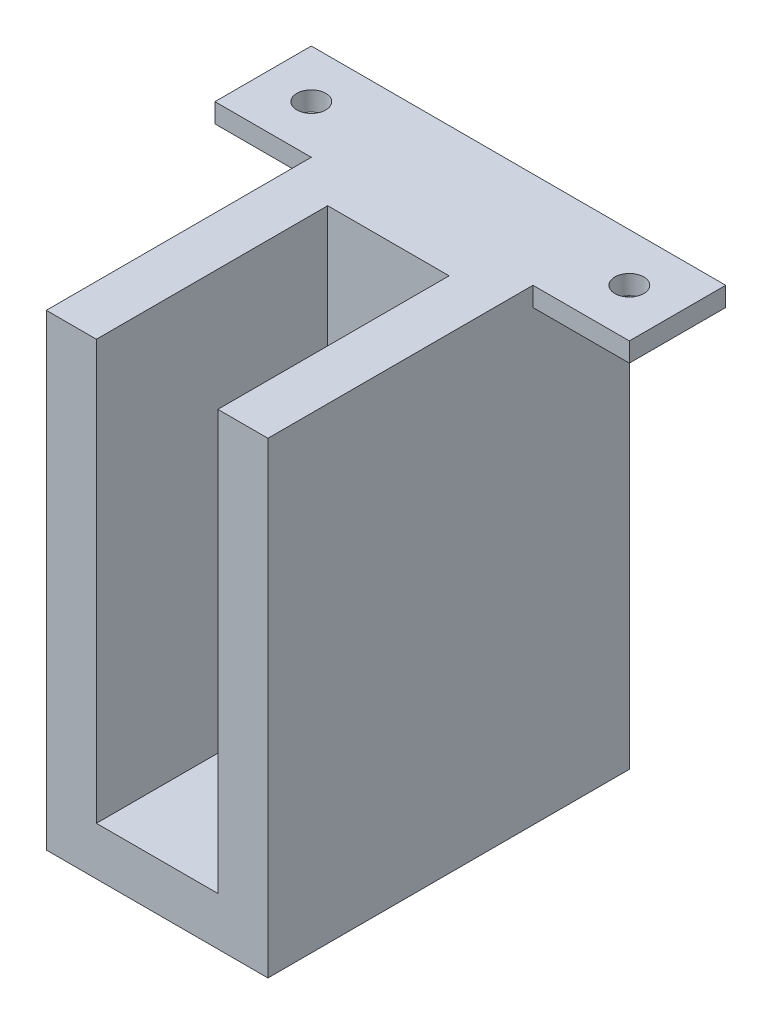
ISO-10303-21;
HEADER;
FILE_DESCRIPTION(('STEP AP214'),'2;1');
FILE_NAME('part.step','',(''),(''),'','','');
FILE_SCHEMA(('AUTOMOTIVE_DESIGN { 1 0 10303 214 1 1 1 1 }'));
ENDSEC;
DATA;
#1=APPLICATION_CONTEXT('core data for automotive mechanical design processes');
#2=APPLICATION_PROTOCOL_DEFINITION('international standard','automotive_design',2000,#1);
#3=PRODUCT_CONTEXT('',#1,'mechanical');
#4=PRODUCT('Part','Part','',(#3));
#5=PRODUCT_RELATED_PRODUCT_CATEGORY('part','',(#4));
#6=PRODUCT_DEFINITION_FORMATION('','',#4);
#7=PRODUCT_DEFINITION_CONTEXT('part definition',#1,'design');
#8=PRODUCT_DEFINITION('design','',#6,#7);
#9=PRODUCT_DEFINITION_SHAPE('','',#8);
#10=(LENGTH_UNIT() NAMED_UNIT(*) SI_UNIT(.MILLI.,.METRE.));
#11=(NAMED_UNIT(*) PLANE_ANGLE_UNIT() SI_UNIT($,.RADIAN.));
#12=(NAMED_UNIT(*) SI_UNIT($,.STERADIAN.) SOLID_ANGLE_UNIT());
#13=UNCERTAINTY_MEASURE_WITH_UNIT(LENGTH_MEASURE(1.E-05),#10,'distance_accuracy_value','');
#14=(GEOMETRIC_REPRESENTATION_CONTEXT(3) GLOBAL_UNCERTAINTY_ASSIGNED_CONTEXT((#13)) GLOBAL_UNIT_ASSIGNED_CONTEXT((#10,
#11,#12)) REPRESENTATION_CONTEXT('',''));
#15=CARTESIAN_POINT('',(0.,0.,0.));
#16=DIRECTION('',(0.,0.,1.));
#17=DIRECTION('',(1.,0.,0.));
#18=AXIS2_PLACEMENT_3D('',#15,#16,#17);
#19=CARTESIAN_POINT('',(11.5,48.5,18.75));
#20=DIRECTION('',(-1.,0.,0.));
#21=DIRECTION('',(0.,0.,1.));
#22=AXIS2_PLACEMENT_3D('',#19,#20,#21);
#23=PLANE('',#22);
#24=DIRECTION('',(0.,0.,-1.));
#25=VECTOR('',#24,1.);
#26=CARTESIAN_POINT('',(11.5,46.5,-18.75));
#27=LINE('',#26,#25);
#28=CARTESIAN_POINT('',(11.5,46.5,-8.75));
#29=VERTEX_POINT('',#28);
#30=CARTESIAN_POINT('',(11.5,46.5,-18.75));
#31=VERTEX_POINT('',#30);
#32=EDGE_CURVE('E191',#29,#31,#27,.T.);
#33=ORIENTED_EDGE('',*,*,#32,.F.);
#34=DIRECTION('',(0.,-1.,0.));
#35=VECTOR('',#34,1.);
#36=CARTESIAN_POINT('',(11.5,48.5,-8.75));
#37=LINE('',#36,#35);
#38=CARTESIAN_POINT('',(11.5,48.5,-8.74999999999999));
#39=VERTEX_POINT('',#38);
#40=EDGE_CURVE('E53',#39,#29,#37,.T.);
#41=ORIENTED_EDGE('',*,*,#40,.F.);
#42=DIRECTION('',(0.,0.,-1.));
#43=VECTOR('',#42,1.);
#44=CARTESIAN_POINT('',(11.5,48.5,18.75));
#45=LINE('',#44,#43);
#46=CARTESIAN_POINT('',(11.5,48.5,18.75));
#47=VERTEX_POINT('',#46);
#48=EDGE_CURVE('E175',#47,#39,#45,.T.);
#49=ORIENTED_EDGE('',*,*,#48,.F.);
#50=DIRECTION('',(0.,-1.,0.));
#51=VECTOR('',#50,1.);
#52=CARTESIAN_POINT('',(11.5,48.5,18.75));
#53=LINE('',#52,#51);
#54=CARTESIAN_POINT('',(11.5,0.,18.75));
#55=VERTEX_POINT('',#54);
#56=EDGE_CURVE('E295',#47,#55,#53,.T.);
#57=ORIENTED_EDGE('',*,*,#56,.T.);
#58=DIRECTION('',(0.,0.,-1.));
#59=VECTOR('',#58,1.);
#60=CARTESIAN_POINT('',(11.5,0.,18.75));
#61=LINE('',#60,#59);
#62=CARTESIAN_POINT('',(11.5,0.,-18.75));
#63=VERTEX_POINT('',#62);
#64=EDGE_CURVE('E279',#55,#63,#61,.T.);
#65=ORIENTED_EDGE('',*,*,#64,.T.);
#66=DIRECTION('',(0.,-1.,0.));
#67=VECTOR('',#66,1.);
#68=CARTESIAN_POINT('',(11.5,48.5,-18.75));
#69=LINE('',#68,#67);
#70=EDGE_CURVE('E11',#31,#63,#69,.T.);
#71=ORIENTED_EDGE('',*,*,#70,.F.);
#72=EDGE_LOOP('',(#33,#41,#49,#57,#65,#71));
#73=FACE_BOUND('',#72,.T.);
#74=ADVANCED_FACE('F37',(#73),#23,.F.);
#75=CARTESIAN_POINT('',(-11.5,48.5,18.75));
#76=DIRECTION('',(1.,0.,0.));
#77=DIRECTION('',(0.,0.,-1.));
#78=AXIS2_PLACEMENT_3D('',#75,#76,#77);
#79=PLANE('',#78);
#80=DIRECTION('',(0.,1.,0.));
#81=VECTOR('',#80,1.);
#82=CARTESIAN_POINT('',(-11.5,48.5,-8.74999999999999));
#83=LINE('',#82,#81);
#84=CARTESIAN_POINT('',(-11.5,46.5,-8.75));
#85=VERTEX_POINT('',#84);
#86=CARTESIAN_POINT('',(-11.5,48.5,-8.74999999999999));
#87=VERTEX_POINT('',#86);
#88=EDGE_CURVE('E210',#85,#87,#83,.T.);
#89=ORIENTED_EDGE('',*,*,#88,.F.);
#90=DIRECTION('',(0.,0.,1.));
#91=VECTOR('',#90,1.);
#92=CARTESIAN_POINT('',(-11.5,46.5,-18.75));
#93=LINE('',#92,#91);
#94=CARTESIAN_POINT('',(-11.5,46.5,-18.75));
#95=VERTEX_POINT('',#94);
#96=EDGE_CURVE('E207',#95,#85,#93,.T.);
#97=ORIENTED_EDGE('',*,*,#96,.F.);
#98=DIRECTION('',(0.,-1.,0.));
#99=VECTOR('',#98,1.);
#100=CARTESIAN_POINT('',(-11.5,48.5,-18.75));
#101=LINE('',#100,#99);
#102=CARTESIAN_POINT('',(-11.5,0.,-18.75));
#103=VERTEX_POINT('',#102);
#104=EDGE_CURVE('E45',#95,#103,#101,.T.);
#105=ORIENTED_EDGE('',*,*,#104,.T.);
#106=DIRECTION('',(0.,0.,1.));
#107=VECTOR('',#106,1.);
#108=CARTESIAN_POINT('',(-11.5,0.,18.75));
#109=LINE('',#108,#107);
#110=CARTESIAN_POINT('',(-11.5,0.,18.75));
#111=VERTEX_POINT('',#110);
#112=EDGE_CURVE('E299',#103,#111,#109,.T.);
#113=ORIENTED_EDGE('',*,*,#112,.T.);
#114=DIRECTION('',(0.,-1.,0.));
#115=VECTOR('',#114,1.);
#116=CARTESIAN_POINT('',(-11.5,48.5,18.75));
#117=LINE('',#116,#115);
#118=CARTESIAN_POINT('',(-11.5,48.5,18.75));
#119=VERTEX_POINT('',#118);
#120=EDGE_CURVE('E304',#119,#111,#117,.T.);
#121=ORIENTED_EDGE('',*,*,#120,.F.);
#122=DIRECTION('',(0.,0.,1.));
#123=VECTOR('',#122,1.);
#124=CARTESIAN_POINT('',(-11.5,48.5,18.75));
#125=LINE('',#124,#123);
#126=EDGE_CURVE('E174',#87,#119,#125,.T.);
#127=ORIENTED_EDGE('',*,*,#126,.F.);
#128=EDGE_LOOP('',(#89,#97,#105,#113,#121,#127));
#129=FACE_BOUND('',#128,.T.);
#130=ADVANCED_FACE('F338',(#129),#79,.F.);
#131=CARTESIAN_POINT('',(-6.3,5.,-5.24999999999999));
#132=DIRECTION('',(0.,0.,-1.));
#133=DIRECTION('',(-1.,0.,0.));
#134=AXIS2_PLACEMENT_3D('',#131,#132,#133);
#135=PLANE('',#134);
#136=DIRECTION('',(0.,1.,0.));
#137=VECTOR('',#136,1.);
#138=CARTESIAN_POINT('',(6.3,5.,-5.24999999999999));
#139=LINE('',#138,#137);
#140=CARTESIAN_POINT('',(6.3,5.,-5.24999999999999));
#141=VERTEX_POINT('',#140);
#142=CARTESIAN_POINT('',(6.3,25.,-5.24999999999999));
#143=VERTEX_POINT('',#142);
#144=EDGE_CURVE('E281',#141,#143,#139,.T.);
#145=ORIENTED_EDGE('',*,*,#144,.T.);
#146=DIRECTION('',(1.,0.,0.));
#147=VECTOR('',#146,1.);
#148=CARTESIAN_POINT('',(6.3,25.,-5.24999999999999));
#149=LINE('',#148,#147);
#150=CARTESIAN_POINT('',(-6.3,25.,-5.24999999999999));
#151=VERTEX_POINT('',#150);
#152=EDGE_CURVE('E234',#151,#143,#149,.T.);
#153=ORIENTED_EDGE('',*,*,#152,.F.);
#154=DIRECTION('',(0.,1.,0.));
#155=VECTOR('',#154,1.);
#156=CARTESIAN_POINT('',(-6.3,5.,-5.24999999999999));
#157=LINE('',#156,#155);
#158=CARTESIAN_POINT('',(-6.3,5.,-5.24999999999999));
#159=VERTEX_POINT('',#158);
#160=EDGE_CURVE('E276',#159,#151,#157,.T.);
#161=ORIENTED_EDGE('',*,*,#160,.F.);
#162=DIRECTION('',(-1.,0.,0.));
#163=VECTOR('',#162,1.);
#164=CARTESIAN_POINT('',(-6.3,5.,-5.24999999999999));
#165=LINE('',#164,#163);
#166=EDGE_CURVE('E266',#141,#159,#165,.T.);
#167=ORIENTED_EDGE('',*,*,#166,.F.);
#168=EDGE_LOOP('',(#145,#153,#161,#167));
#169=FACE_BOUND('',#168,.T.);
#170=ADVANCED_FACE('F342',(#169),#135,.F.);
#171=CARTESIAN_POINT('',(-11.5,48.5,-18.75));
#172=DIRECTION('',(0.,0.,1.));
#173=DIRECTION('',(1.,0.,0.));
#174=AXIS2_PLACEMENT_3D('',#171,#172,#173);
#175=PLANE('',#174);
#176=DIRECTION('',(-1.,0.,0.));
#177=VECTOR('',#176,1.);
#178=CARTESIAN_POINT('',(-11.5,0.,-18.75));
#179=LINE('',#178,#177);
#180=EDGE_CURVE('E297',#63,#103,#179,.T.);
#181=ORIENTED_EDGE('',*,*,#180,.T.);
#182=ORIENTED_EDGE('',*,*,#104,.F.);
#183=DIRECTION('',(1.,0.,0.));
#184=VECTOR('',#183,1.);
#185=CARTESIAN_POINT('',(-21.5,46.5,-18.75));
#186=LINE('',#185,#184);
#187=CARTESIAN_POINT('',(-21.5,46.5,-18.75));
#188=VERTEX_POINT('',#187);
#189=EDGE_CURVE('E226',#188,#95,#186,.T.);
#190=ORIENTED_EDGE('',*,*,#189,.F.);
#191=DIRECTION('',(0.,-1.,0.));
#192=VECTOR('',#191,1.);
#193=CARTESIAN_POINT('',(-21.5,48.5,-18.75));
#194=LINE('',#193,#192);
#195=CARTESIAN_POINT('',(-21.5,48.5,-18.75));
#196=VERTEX_POINT('',#195);
#197=EDGE_CURVE('E170',#196,#188,#194,.T.);
#198=ORIENTED_EDGE('',*,*,#197,.F.);
#199=DIRECTION('',(-1.,0.,0.));
#200=VECTOR('',#199,1.);
#201=CARTESIAN_POINT('',(-11.5,48.5,-18.75));
#202=LINE('',#201,#200);
#203=CARTESIAN_POINT('',(21.5,48.5,-18.75));
#204=VERTEX_POINT('',#203);
#205=EDGE_CURVE('E161',#204,#196,#202,.T.);
#206=ORIENTED_EDGE('',*,*,#205,.F.);
#207=DIRECTION('',(0.,1.,0.));
#208=VECTOR('',#207,1.);
#209=CARTESIAN_POINT('',(21.5,48.5,-18.75));
#210=LINE('',#209,#208);
#211=CARTESIAN_POINT('',(21.5,46.5,-18.75));
#212=VERTEX_POINT('',#211);
#213=EDGE_CURVE('E167',#212,#204,#210,.T.);
#214=ORIENTED_EDGE('',*,*,#213,.F.);
#215=DIRECTION('',(-1.,0.,0.));
#216=VECTOR('',#215,1.);
#217=CARTESIAN_POINT('',(21.5,46.5,-18.75));
#218=LINE('',#217,#216);
#219=EDGE_CURVE('E200',#212,#31,#218,.T.);
#220=ORIENTED_EDGE('',*,*,#219,.T.);
#221=ORIENTED_EDGE('',*,*,#70,.T.);
#222=EDGE_LOOP('',(#181,#182,#190,#198,#206,#214,#220,#221));
#223=FACE_BOUND('',#222,.T.);
#224=ADVANCED_FACE('F164',(#223),#175,.F.);
#225=CARTESIAN_POINT('',(-11.5,48.5,18.75));
#226=DIRECTION('',(0.,0.,-1.));
#227=DIRECTION('',(-1.,0.,0.));
#228=AXIS2_PLACEMENT_3D('',#225,#226,#227);
#229=PLANE('',#228);
#230=DIRECTION('',(1.,0.,0.));
#231=VECTOR('',#230,1.);
#232=CARTESIAN_POINT('',(-6.3,5.,18.75));
#233=LINE('',#232,#231);
#234=CARTESIAN_POINT('',(-6.3,5.,18.75));
#235=VERTEX_POINT('',#234);
#236=CARTESIAN_POINT('',(6.3,5.,18.75));
#237=VERTEX_POINT('',#236);
#238=EDGE_CURVE('E259',#235,#237,#233,.T.);
#239=ORIENTED_EDGE('',*,*,#238,.F.);
#240=DIRECTION('',(0.,1.,0.));
#241=VECTOR('',#240,1.);
#242=CARTESIAN_POINT('',(-6.3,5.,18.75));
#243=LINE('',#242,#241);
#244=CARTESIAN_POINT('',(-6.3,48.5,18.75));
#245=VERTEX_POINT('',#244);
#246=EDGE_CURVE('E269',#235,#245,#243,.T.);
#247=ORIENTED_EDGE('',*,*,#246,.T.);
#248=DIRECTION('',(1.,0.,0.));
#249=VECTOR('',#248,1.);
#250=CARTESIAN_POINT('',(-11.5,48.5,18.75));
#251=LINE('',#250,#249);
#252=EDGE_CURVE('E293',#119,#245,#251,.T.);
#253=ORIENTED_EDGE('',*,*,#252,.F.);
#254=ORIENTED_EDGE('',*,*,#120,.T.);
#255=DIRECTION('',(1.,0.,0.));
#256=VECTOR('',#255,1.);
#257=CARTESIAN_POINT('',(-11.5,0.,18.75));
#258=LINE('',#257,#256);
#259=EDGE_CURVE('E289',#111,#55,#258,.T.);
#260=ORIENTED_EDGE('',*,*,#259,.T.);
#261=ORIENTED_EDGE('',*,*,#56,.F.);
#262=CARTESIAN_POINT('',(6.3,48.5,18.75));
#263=VERTEX_POINT('',#262);
#264=EDGE_CURVE('E292',#263,#47,#251,.T.);
#265=ORIENTED_EDGE('',*,*,#264,.F.);
#266=DIRECTION('',(0.,1.,0.));
#267=VECTOR('',#266,1.);
#268=CARTESIAN_POINT('',(6.3,5.,18.75));
#269=LINE('',#268,#267);
#270=EDGE_CURVE('E285',#237,#263,#269,.T.);
#271=ORIENTED_EDGE('',*,*,#270,.F.);
#272=EDGE_LOOP('',(#239,#247,#253,#254,#260,#261,#265,#271));
#273=FACE_BOUND('',#272,.T.);
#274=ADVANCED_FACE('F324',(#273),#229,.F.);
#275=CARTESIAN_POINT('',(0.,48.5,0.));
#276=DIRECTION('',(0.,-1.,0.));
#277=DIRECTION('',(0.,0.,-1.));
#278=AXIS2_PLACEMENT_3D('',#275,#276,#277);
#279=PLANE('',#278);
#280=CARTESIAN_POINT('',(16.5,48.5,-13.75));
#281=DIRECTION('',(0.,1.,0.));
#282=DIRECTION('',(0.,0.,1.));
#283=AXIS2_PLACEMENT_3D('',#280,#281,#282);
#284=CIRCLE('',#283,1.5);
#285=CARTESIAN_POINT('',(16.5,48.5,-12.25));
#286=VERTEX_POINT('',#285);
#287=EDGE_CURVE('E309',#286,#286,#284,.T.);
#288=ORIENTED_EDGE('',*,*,#287,.F.);
#289=EDGE_LOOP('',(#288));
#290=FACE_BOUND('',#289,.T.);
#291=CARTESIAN_POINT('',(-16.5,48.5,-13.75));
#292=DIRECTION('',(0.,1.,0.));
#293=DIRECTION('',(0.,0.,1.));
#294=AXIS2_PLACEMENT_3D('',#291,#292,#293);
#295=CIRCLE('',#294,1.5);
#296=CARTESIAN_POINT('',(-16.5,48.5,-12.25));
#297=VERTEX_POINT('',#296);
#298=EDGE_CURVE('E195',#297,#297,#295,.T.);
#299=ORIENTED_EDGE('',*,*,#298,.F.);
#300=EDGE_LOOP('',(#299));
#301=FACE_BOUND('',#300,.T.);
#302=ORIENTED_EDGE('',*,*,#252,.T.);
#303=DIRECTION('',(0.,0.,1.));
#304=VECTOR('',#303,1.);
#305=CARTESIAN_POINT('',(-6.3,48.5,18.75));
#306=LINE('',#305,#304);
#307=CARTESIAN_POINT('',(-6.3,48.5,-5.24999999999999));
#308=VERTEX_POINT('',#307);
#309=EDGE_CURVE('E250',#308,#245,#306,.T.);
#310=ORIENTED_EDGE('',*,*,#309,.F.);
#311=DIRECTION('',(-1.,0.,0.));
#312=VECTOR('',#311,1.);
#313=CARTESIAN_POINT('',(-6.3,48.5,-5.24999999999999));
#314=LINE('',#313,#312);
#315=CARTESIAN_POINT('',(6.3,48.5,-5.24999999999999));
#316=VERTEX_POINT('',#315);
#317=EDGE_CURVE('E260',#316,#308,#314,.T.);
#318=ORIENTED_EDGE('',*,*,#317,.F.);
#319=DIRECTION('',(0.,0.,-1.));
#320=VECTOR('',#319,1.);
#321=CARTESIAN_POINT('',(6.3,48.5,18.75));
#322=LINE('',#321,#320);
#323=EDGE_CURVE('E271',#263,#316,#322,.T.);
#324=ORIENTED_EDGE('',*,*,#323,.F.);
#325=ORIENTED_EDGE('',*,*,#264,.T.);
#326=ORIENTED_EDGE('',*,*,#48,.T.);
#327=DIRECTION('',(-1.,0.,0.));
#328=VECTOR('',#327,1.);
#329=CARTESIAN_POINT('',(21.5,48.5,-8.75));
#330=LINE('',#329,#328);
#331=CARTESIAN_POINT('',(21.5,48.5,-8.75));
#332=VERTEX_POINT('',#331);
#333=EDGE_CURVE('E182',#332,#39,#330,.T.);
#334=ORIENTED_EDGE('',*,*,#333,.F.);
#335=DIRECTION('',(0.,0.,1.));
#336=VECTOR('',#335,1.);
#337=CARTESIAN_POINT('',(21.5,48.5,-18.75));
#338=LINE('',#337,#336);
#339=EDGE_CURVE('E178',#204,#332,#338,.T.);
#340=ORIENTED_EDGE('',*,*,#339,.F.);
#341=ORIENTED_EDGE('',*,*,#205,.T.);
#342=DIRECTION('',(0.,0.,-1.));
#343=VECTOR('',#342,1.);
#344=CARTESIAN_POINT('',(-21.5,48.5,-18.75));
#345=LINE('',#344,#343);
#346=CARTESIAN_POINT('',(-21.5,48.5,-8.74999999999999));
#347=VERTEX_POINT('',#346);
#348=EDGE_CURVE('E214',#347,#196,#345,.T.);
#349=ORIENTED_EDGE('',*,*,#348,.F.);
#350=DIRECTION('',(1.,0.,0.));
#351=VECTOR('',#350,1.);
#352=CARTESIAN_POINT('',(-21.5,48.5,-8.74999999999999));
#353=LINE('',#352,#351);
#354=EDGE_CURVE('E216',#347,#87,#353,.T.);
#355=ORIENTED_EDGE('',*,*,#354,.T.);
#356=ORIENTED_EDGE('',*,*,#126,.T.);
#357=EDGE_LOOP('',(#302,#310,#318,#324,#325,#326,#334,#340,#341,#349,#355,#356));
#358=FACE_BOUND('',#357,.T.);
#359=ADVANCED_FACE('F180',(#290,#301,#358),#279,.F.);
#360=CARTESIAN_POINT('',(0.,0.,0.));
#361=DIRECTION('',(0.,-1.,0.));
#362=DIRECTION('',(0.,0.,-1.));
#363=AXIS2_PLACEMENT_3D('',#360,#361,#362);
#364=PLANE('',#363);
#365=ORIENTED_EDGE('',*,*,#64,.F.);
#366=ORIENTED_EDGE('',*,*,#259,.F.);
#367=ORIENTED_EDGE('',*,*,#112,.F.);
#368=ORIENTED_EDGE('',*,*,#180,.F.);
#369=EDGE_LOOP('',(#365,#366,#367,#368));
#370=FACE_BOUND('',#369,.T.);
#371=ADVANCED_FACE('F323',(#370),#364,.T.);
#372=CARTESIAN_POINT('',(-6.3,5.,18.75));
#373=DIRECTION('',(-1.,0.,0.));
#374=DIRECTION('',(0.,0.,1.));
#375=AXIS2_PLACEMENT_3D('',#372,#373,#374);
#376=PLANE('',#375);
#377=ORIENTED_EDGE('',*,*,#309,.T.);
#378=ORIENTED_EDGE('',*,*,#246,.F.);
#379=DIRECTION('',(0.,0.,1.));
#380=VECTOR('',#379,1.);
#381=CARTESIAN_POINT('',(-6.3,5.,18.75));
#382=LINE('',#381,#380);
#383=EDGE_CURVE('E256',#159,#235,#382,.T.);
#384=ORIENTED_EDGE('',*,*,#383,.F.);
#385=ORIENTED_EDGE('',*,*,#160,.T.);
#386=DIRECTION('',(0.,0.,1.));
#387=VECTOR('',#386,1.);
#388=CARTESIAN_POINT('',(-6.3,25.,-10.25));
#389=LINE('',#388,#387);
#390=CARTESIAN_POINT('',(-6.3,25.,-10.25));
#391=VERTEX_POINT('',#390);
#392=EDGE_CURVE('E251',#391,#151,#389,.T.);
#393=ORIENTED_EDGE('',*,*,#392,.F.);
#394=DIRECTION('',(0.,-1.,0.));
#395=VECTOR('',#394,1.);
#396=CARTESIAN_POINT('',(-6.3,25.,-10.25));
#397=LINE('',#396,#395);
#398=CARTESIAN_POINT('',(-6.3,28.,-10.25));
#399=VERTEX_POINT('',#398);
#400=EDGE_CURVE('E237',#399,#391,#397,.T.);
#401=ORIENTED_EDGE('',*,*,#400,.F.);
#402=DIRECTION('',(0.,0.,1.));
#403=VECTOR('',#402,1.);
#404=CARTESIAN_POINT('',(-6.3,28.,-10.25));
#405=LINE('',#404,#403);
#406=CARTESIAN_POINT('',(-6.3,28.,-5.24999999999999));
#407=VERTEX_POINT('',#406);
#408=EDGE_CURVE('E253',#399,#407,#405,.T.);
#409=ORIENTED_EDGE('',*,*,#408,.T.);
#410=EDGE_CURVE('E280',#407,#308,#157,.T.);
#411=ORIENTED_EDGE('',*,*,#410,.T.);
#412=EDGE_LOOP('',(#377,#378,#384,#385,#393,#401,#409,#411));
#413=FACE_BOUND('',#412,.T.);
#414=ADVANCED_FACE('F331',(#413),#376,.F.);
#415=ORIENTED_EDGE('',*,*,#410,.F.);
#416=DIRECTION('',(-1.,0.,0.));
#417=VECTOR('',#416,1.);
#418=CARTESIAN_POINT('',(6.3,28.,-5.24999999999999));
#419=LINE('',#418,#417);
#420=CARTESIAN_POINT('',(6.3,28.,-5.24999999999999));
#421=VERTEX_POINT('',#420);
#422=EDGE_CURVE('E229',#421,#407,#419,.T.);
#423=ORIENTED_EDGE('',*,*,#422,.F.);
#424=EDGE_CURVE('E284',#421,#316,#139,.T.);
#425=ORIENTED_EDGE('',*,*,#424,.T.);
#426=ORIENTED_EDGE('',*,*,#317,.T.);
#427=EDGE_LOOP('',(#415,#423,#425,#426));
#428=FACE_BOUND('',#427,.T.);
#429=ADVANCED_FACE('F398',(#428),#135,.F.);
#430=CARTESIAN_POINT('',(6.3,5.,18.75));
#431=DIRECTION('',(1.,0.,0.));
#432=DIRECTION('',(0.,0.,-1.));
#433=AXIS2_PLACEMENT_3D('',#430,#431,#432);
#434=PLANE('',#433);
#435=ORIENTED_EDGE('',*,*,#323,.T.);
#436=ORIENTED_EDGE('',*,*,#424,.F.);
#437=DIRECTION('',(0.,0.,1.));
#438=VECTOR('',#437,1.);
#439=CARTESIAN_POINT('',(6.3,28.,-10.25));
#440=LINE('',#439,#438);
#441=CARTESIAN_POINT('',(6.3,28.,-10.25));
#442=VERTEX_POINT('',#441);
#443=EDGE_CURVE('E243',#442,#421,#440,.T.);
#444=ORIENTED_EDGE('',*,*,#443,.F.);
#445=DIRECTION('',(0.,1.,0.));
#446=VECTOR('',#445,1.);
#447=CARTESIAN_POINT('',(6.3,25.,-10.25));
#448=LINE('',#447,#446);
#449=CARTESIAN_POINT('',(6.3,25.,-10.25));
#450=VERTEX_POINT('',#449);
#451=EDGE_CURVE('E230',#450,#442,#448,.T.);
#452=ORIENTED_EDGE('',*,*,#451,.F.);
#453=DIRECTION('',(0.,0.,1.));
#454=VECTOR('',#453,1.);
#455=CARTESIAN_POINT('',(6.3,25.,-10.25));
#456=LINE('',#455,#454);
#457=EDGE_CURVE('E247',#450,#143,#456,.T.);
#458=ORIENTED_EDGE('',*,*,#457,.T.);
#459=ORIENTED_EDGE('',*,*,#144,.F.);
#460=DIRECTION('',(0.,0.,-1.));
#461=VECTOR('',#460,1.);
#462=CARTESIAN_POINT('',(6.3,5.,18.75));
#463=LINE('',#462,#461);
#464=EDGE_CURVE('E263',#237,#141,#463,.T.);
#465=ORIENTED_EDGE('',*,*,#464,.F.);
#466=ORIENTED_EDGE('',*,*,#270,.T.);
#467=EDGE_LOOP('',(#435,#436,#444,#452,#458,#459,#465,#466));
#468=FACE_BOUND('',#467,.T.);
#469=ADVANCED_FACE('F396',(#468),#434,.F.);
#470=CARTESIAN_POINT('',(0.,5.,0.));
#471=DIRECTION('',(0.,-1.,0.));
#472=DIRECTION('',(0.,0.,-1.));
#473=AXIS2_PLACEMENT_3D('',#470,#471,#472);
#474=PLANE('',#473);
#475=ORIENTED_EDGE('',*,*,#383,.T.);
#476=ORIENTED_EDGE('',*,*,#238,.T.);
#477=ORIENTED_EDGE('',*,*,#464,.T.);
#478=ORIENTED_EDGE('',*,*,#166,.T.);
#479=EDGE_LOOP('',(#475,#476,#477,#478));
#480=FACE_BOUND('',#479,.T.);
#481=ADVANCED_FACE('F389',(#480),#474,.F.);
#482=CARTESIAN_POINT('',(6.3,25.,-10.25));
#483=DIRECTION('',(0.,-1.,0.));
#484=DIRECTION('',(0.,0.,-1.));
#485=AXIS2_PLACEMENT_3D('',#482,#483,#484);
#486=PLANE('',#485);
#487=ORIENTED_EDGE('',*,*,#152,.T.);
#488=ORIENTED_EDGE('',*,*,#457,.F.);
#489=DIRECTION('',(1.,0.,0.));
#490=VECTOR('',#489,1.);
#491=CARTESIAN_POINT('',(6.3,25.,-10.25));
#492=LINE('',#491,#490);
#493=EDGE_CURVE('E240',#391,#450,#492,.T.);
#494=ORIENTED_EDGE('',*,*,#493,.F.);
#495=ORIENTED_EDGE('',*,*,#392,.T.);
#496=EDGE_LOOP('',(#487,#488,#494,#495));
#497=FACE_BOUND('',#496,.T.);
#498=ADVANCED_FACE('F386',(#497),#486,.F.);
#499=CARTESIAN_POINT('',(6.3,28.,-10.25));
#500=DIRECTION('',(0.,1.,0.));
#501=DIRECTION('',(0.,0.,1.));
#502=AXIS2_PLACEMENT_3D('',#499,#500,#501);
#503=PLANE('',#502);
#504=ORIENTED_EDGE('',*,*,#422,.T.);
#505=ORIENTED_EDGE('',*,*,#408,.F.);
#506=DIRECTION('',(-1.,0.,0.));
#507=VECTOR('',#506,1.);
#508=CARTESIAN_POINT('',(6.3,28.,-10.25));
#509=LINE('',#508,#507);
#510=EDGE_CURVE('E233',#442,#399,#509,.T.);
#511=ORIENTED_EDGE('',*,*,#510,.F.);
#512=ORIENTED_EDGE('',*,*,#443,.T.);
#513=EDGE_LOOP('',(#504,#505,#511,#512));
#514=FACE_BOUND('',#513,.T.);
#515=ADVANCED_FACE('F384',(#514),#503,.F.);
#516=CARTESIAN_POINT('',(0.,0.,-10.25));
#517=DIRECTION('',(0.,0.,1.));
#518=DIRECTION('',(1.,0.,0.));
#519=AXIS2_PLACEMENT_3D('',#516,#517,#518);
#520=PLANE('',#519);
#521=ORIENTED_EDGE('',*,*,#451,.T.);
#522=ORIENTED_EDGE('',*,*,#510,.T.);
#523=ORIENTED_EDGE('',*,*,#400,.T.);
#524=ORIENTED_EDGE('',*,*,#493,.T.);
#525=EDGE_LOOP('',(#521,#522,#523,#524));
#526=FACE_BOUND('',#525,.T.);
#527=ADVANCED_FACE('F377',(#526),#520,.T.);
#528=CARTESIAN_POINT('',(-21.5,46.5,-18.75));
#529=DIRECTION('',(0.,1.,0.));
#530=DIRECTION('',(0.,0.,1.));
#531=AXIS2_PLACEMENT_3D('',#528,#529,#530);
#532=PLANE('',#531);
#533=CARTESIAN_POINT('',(-16.5,46.5,-13.75));
#534=DIRECTION('',(0.,1.,0.));
#535=DIRECTION('',(0.,0.,1.));
#536=AXIS2_PLACEMENT_3D('',#533,#534,#535);
#537=CIRCLE('',#536,1.5);
#538=CARTESIAN_POINT('',(-16.5,46.5,-12.25));
#539=VERTEX_POINT('',#538);
#540=EDGE_CURVE('E40',#539,#539,#537,.T.);
#541=ORIENTED_EDGE('',*,*,#540,.T.);
#542=EDGE_LOOP('',(#541));
#543=FACE_BOUND('',#542,.T.);
#544=ORIENTED_EDGE('',*,*,#96,.T.);
#545=DIRECTION('',(1.,0.,0.));
#546=VECTOR('',#545,1.);
#547=CARTESIAN_POINT('',(-21.5,46.5,-8.75));
#548=LINE('',#547,#546);
#549=CARTESIAN_POINT('',(-21.5,46.5,-8.75));
#550=VERTEX_POINT('',#549);
#551=EDGE_CURVE('E223',#550,#85,#548,.T.);
#552=ORIENTED_EDGE('',*,*,#551,.F.);
#553=DIRECTION('',(0.,0.,1.));
#554=VECTOR('',#553,1.);
#555=CARTESIAN_POINT('',(-21.5,46.5,-18.75));
#556=LINE('',#555,#554);
#557=EDGE_CURVE('E209',#188,#550,#556,.T.);
#558=ORIENTED_EDGE('',*,*,#557,.F.);
#559=ORIENTED_EDGE('',*,*,#189,.T.);
#560=EDGE_LOOP('',(#544,#552,#558,#559));
#561=FACE_BOUND('',#560,.T.);
#562=ADVANCED_FACE('F362',(#543,#561),#532,.F.);
#563=CARTESIAN_POINT('',(-21.5,48.5,-8.74999999999999));
#564=DIRECTION('',(0.,0.,-1.));
#565=DIRECTION('',(0.,1.,0.));
#566=AXIS2_PLACEMENT_3D('',#563,#564,#565);
#567=PLANE('',#566);
#568=ORIENTED_EDGE('',*,*,#88,.T.);
#569=ORIENTED_EDGE('',*,*,#354,.F.);
#570=DIRECTION('',(0.,1.,0.));
#571=VECTOR('',#570,1.);
#572=CARTESIAN_POINT('',(-21.5,48.5,-8.74999999999999));
#573=LINE('',#572,#571);
#574=EDGE_CURVE('E212',#550,#347,#573,.T.);
#575=ORIENTED_EDGE('',*,*,#574,.F.);
#576=ORIENTED_EDGE('',*,*,#551,.T.);
#577=EDGE_LOOP('',(#568,#569,#575,#576));
#578=FACE_BOUND('',#577,.T.);
#579=ADVANCED_FACE('F369',(#578),#567,.F.);
#580=CARTESIAN_POINT('',(-21.5,0.,0.));
#581=DIRECTION('',(-1.,0.,0.));
#582=DIRECTION('',(0.,0.,1.));
#583=AXIS2_PLACEMENT_3D('',#580,#581,#582);
#584=PLANE('',#583);
#585=ORIENTED_EDGE('',*,*,#197,.T.);
#586=ORIENTED_EDGE('',*,*,#557,.T.);
#587=ORIENTED_EDGE('',*,*,#574,.T.);
#588=ORIENTED_EDGE('',*,*,#348,.T.);
#589=EDGE_LOOP('',(#585,#586,#587,#588));
#590=FACE_BOUND('',#589,.T.);
#591=ADVANCED_FACE('F366',(#590),#584,.T.);
#592=CARTESIAN_POINT('',(21.5,48.5,-8.75));
#593=DIRECTION('',(0.,0.,-1.));
#594=DIRECTION('',(-1.,0.,0.));
#595=AXIS2_PLACEMENT_3D('',#592,#593,#594);
#596=PLANE('',#595);
#597=ORIENTED_EDGE('',*,*,#40,.T.);
#598=DIRECTION('',(-1.,0.,0.));
#599=VECTOR('',#598,1.);
#600=CARTESIAN_POINT('',(21.5,46.5,-8.75));
#601=LINE('',#600,#599);
#602=CARTESIAN_POINT('',(21.5,46.5,-8.75));
#603=VERTEX_POINT('',#602);
#604=EDGE_CURVE('E203',#603,#29,#601,.T.);
#605=ORIENTED_EDGE('',*,*,#604,.F.);
#606=DIRECTION('',(0.,-1.,0.));
#607=VECTOR('',#606,1.);
#608=CARTESIAN_POINT('',(21.5,48.5,-8.75));
#609=LINE('',#608,#607);
#610=EDGE_CURVE('E185',#332,#603,#609,.T.);
#611=ORIENTED_EDGE('',*,*,#610,.F.);
#612=ORIENTED_EDGE('',*,*,#333,.T.);
#613=EDGE_LOOP('',(#597,#605,#611,#612));
#614=FACE_BOUND('',#613,.T.);
#615=ADVANCED_FACE('F348',(#614),#596,.F.);
#616=CARTESIAN_POINT('',(21.5,46.5,-18.75));
#617=DIRECTION('',(0.,1.,0.));
#618=DIRECTION('',(0.,0.,1.));
#619=AXIS2_PLACEMENT_3D('',#616,#617,#618);
#620=PLANE('',#619);
#621=CARTESIAN_POINT('',(16.5,46.5,-13.75));
#622=DIRECTION('',(0.,1.,0.));
#623=DIRECTION('',(0.,0.,1.));
#624=AXIS2_PLACEMENT_3D('',#621,#622,#623);
#625=CIRCLE('',#624,1.5);
#626=CARTESIAN_POINT('',(16.5,46.5,-12.25));
#627=VERTEX_POINT('',#626);
#628=EDGE_CURVE('E307',#627,#627,#625,.T.);
#629=ORIENTED_EDGE('',*,*,#628,.T.);
#630=EDGE_LOOP('',(#629));
#631=FACE_BOUND('',#630,.T.);
#632=ORIENTED_EDGE('',*,*,#32,.T.);
#633=ORIENTED_EDGE('',*,*,#219,.F.);
#634=DIRECTION('',(0.,0.,-1.));
#635=VECTOR('',#634,1.);
#636=CARTESIAN_POINT('',(21.5,46.5,-18.75));
#637=LINE('',#636,#635);
#638=EDGE_CURVE('E189',#603,#212,#637,.T.);
#639=ORIENTED_EDGE('',*,*,#638,.F.);
#640=ORIENTED_EDGE('',*,*,#604,.T.);
#641=EDGE_LOOP('',(#632,#633,#639,#640));
#642=FACE_BOUND('',#641,.T.);
#643=ADVANCED_FACE('F349',(#631,#642),#620,.F.);
#644=CARTESIAN_POINT('',(21.5,0.,0.));
#645=DIRECTION('',(-1.,0.,0.));
#646=DIRECTION('',(0.,0.,1.));
#647=AXIS2_PLACEMENT_3D('',#644,#645,#646);
#648=PLANE('',#647);
#649=ORIENTED_EDGE('',*,*,#213,.T.);
#650=ORIENTED_EDGE('',*,*,#339,.T.);
#651=ORIENTED_EDGE('',*,*,#610,.T.);
#652=ORIENTED_EDGE('',*,*,#638,.T.);
#653=EDGE_LOOP('',(#649,#650,#651,#652));
#654=FACE_BOUND('',#653,.T.);
#655=ADVANCED_FACE('F187',(#654),#648,.F.);
#656=CARTESIAN_POINT('',(16.5,38.5,-13.75));
#657=DIRECTION('',(0.,1.,0.));
#658=DIRECTION('',(0.,0.,1.));
#659=AXIS2_PLACEMENT_3D('',#656,#657,#658);
#660=CYLINDRICAL_SURFACE('',#659,1.5);
#661=ORIENTED_EDGE('',*,*,#287,.T.);
#662=EDGE_LOOP('',(#661));
#663=FACE_BOUND('',#662,.T.);
#664=ORIENTED_EDGE('',*,*,#628,.F.);
#665=EDGE_LOOP('',(#664));
#666=FACE_BOUND('',#665,.T.);
#667=ADVANCED_FACE('F541',(#663,#666),#660,.F.);
#668=CARTESIAN_POINT('',(-16.5,38.5,-13.75));
#669=DIRECTION('',(0.,1.,0.));
#670=DIRECTION('',(0.,0.,1.));
#671=AXIS2_PLACEMENT_3D('',#668,#669,#670);
#672=CYLINDRICAL_SURFACE('',#671,1.5);
#673=ORIENTED_EDGE('',*,*,#298,.T.);
#674=EDGE_LOOP('',(#673));
#675=FACE_BOUND('',#674,.T.);
#676=ORIENTED_EDGE('',*,*,#540,.F.);
#677=EDGE_LOOP('',(#676));
#678=FACE_BOUND('',#677,.T.);
#679=ADVANCED_FACE('F319',(#675,#678),#672,.F.);
#680=CLOSED_SHELL('',(#74,#130,#170,#224,#274,#359,#371,#414,#429,#469,#481,#498,#515,#527,#562,
#579,#591,#615,#643,#655,#667,#679));
#681=MANIFOLD_SOLID_BREP('B2',#680);
#682=ADVANCED_BREP_SHAPE_REPRESENTATION('',(#18,#681),#14);
#683=SHAPE_DEFINITION_REPRESENTATION(#9,#682);
ENDSEC;
END-ISO-10303-21;
